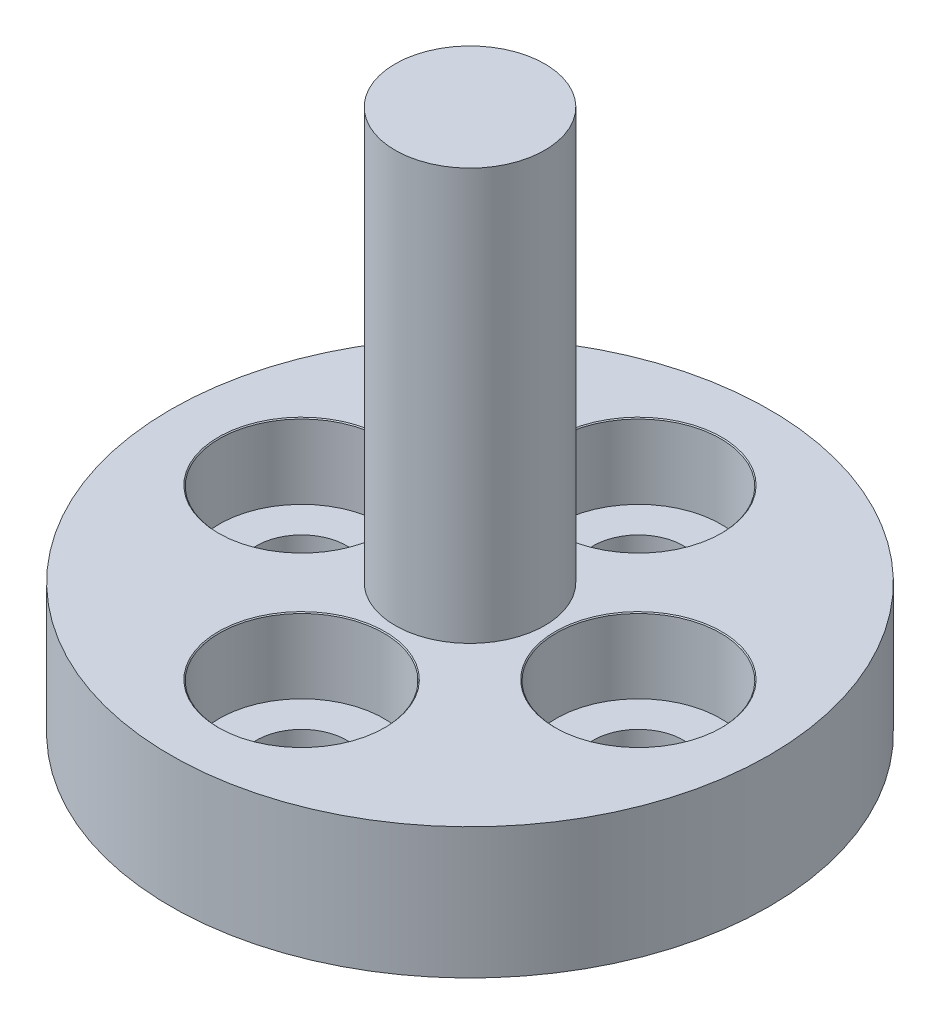
ISO-10303-21;
HEADER;
FILE_DESCRIPTION(('STEP AP214'),'2;1');
FILE_NAME('part.step','',(''),(''),'','','');
FILE_SCHEMA(('AUTOMOTIVE_DESIGN { 1 0 10303 214 1 1 1 1 }'));
ENDSEC;
DATA;
#1=APPLICATION_CONTEXT('core data for automotive mechanical design processes');
#2=APPLICATION_PROTOCOL_DEFINITION('international standard','automotive_design',2000,#1);
#3=PRODUCT_CONTEXT('',#1,'mechanical');
#4=PRODUCT('Part','Part','',(#3));
#5=PRODUCT_RELATED_PRODUCT_CATEGORY('part','',(#4));
#6=PRODUCT_DEFINITION_FORMATION('','',#4);
#7=PRODUCT_DEFINITION_CONTEXT('part definition',#1,'design');
#8=PRODUCT_DEFINITION('design','',#6,#7);
#9=PRODUCT_DEFINITION_SHAPE('','',#8);
#10=(LENGTH_UNIT() NAMED_UNIT(*) SI_UNIT(.MILLI.,.METRE.));
#11=(NAMED_UNIT(*) PLANE_ANGLE_UNIT() SI_UNIT($,.RADIAN.));
#12=(NAMED_UNIT(*) SI_UNIT($,.STERADIAN.) SOLID_ANGLE_UNIT());
#13=UNCERTAINTY_MEASURE_WITH_UNIT(LENGTH_MEASURE(1.E-05),#10,'distance_accuracy_value','');
#14=(GEOMETRIC_REPRESENTATION_CONTEXT(3) GLOBAL_UNCERTAINTY_ASSIGNED_CONTEXT((#13)) GLOBAL_UNIT_ASSIGNED_CONTEXT((#10,
#11,#12)) REPRESENTATION_CONTEXT('',''));
#15=CARTESIAN_POINT('',(0.,0.,0.));
#16=DIRECTION('',(0.,0.,1.));
#17=DIRECTION('',(1.,0.,0.));
#18=AXIS2_PLACEMENT_3D('',#15,#16,#17);
#19=CARTESIAN_POINT('',(0.,0.,0.));
#20=DIRECTION('',(0.,1.,0.));
#21=DIRECTION('',(-1.,0.,0.));
#22=AXIS2_PLACEMENT_3D('',#19,#20,#21);
#23=PLANE('',#22);
#24=CARTESIAN_POINT('',(-4.5,0.,0.));
#25=DIRECTION('',(0.,1.,0.));
#26=DIRECTION('',(0.,0.,1.));
#27=AXIS2_PLACEMENT_3D('',#24,#25,#26);
#28=CIRCLE('',#27,1.2);
#29=CARTESIAN_POINT('',(-4.5,0.,1.2));
#30=VERTEX_POINT('',#29);
#31=EDGE_CURVE('E99',#30,#30,#28,.T.);
#32=ORIENTED_EDGE('',*,*,#31,.T.);
#33=EDGE_LOOP('',(#32));
#34=FACE_BOUND('',#33,.T.);
#35=CARTESIAN_POINT('',(0.,0.,-4.5));
#36=DIRECTION('',(0.,1.,0.));
#37=DIRECTION('',(0.,0.,1.));
#38=AXIS2_PLACEMENT_3D('',#35,#36,#37);
#39=CIRCLE('',#38,1.2);
#40=CARTESIAN_POINT('',(0.,0.,-3.3));
#41=VERTEX_POINT('',#40);
#42=EDGE_CURVE('E84',#41,#41,#39,.T.);
#43=ORIENTED_EDGE('',*,*,#42,.T.);
#44=EDGE_LOOP('',(#43));
#45=FACE_BOUND('',#44,.T.);
#46=CARTESIAN_POINT('',(4.5,0.,0.));
#47=DIRECTION('',(0.,1.,0.));
#48=DIRECTION('',(0.,0.,1.));
#49=AXIS2_PLACEMENT_3D('',#46,#47,#48);
#50=CIRCLE('',#49,1.2);
#51=CARTESIAN_POINT('',(4.5,0.,1.2));
#52=VERTEX_POINT('',#51);
#53=EDGE_CURVE('E69',#52,#52,#50,.T.);
#54=ORIENTED_EDGE('',*,*,#53,.T.);
#55=EDGE_LOOP('',(#54));
#56=FACE_BOUND('',#55,.T.);
#57=CARTESIAN_POINT('',(0.,0.,4.5));
#58=DIRECTION('',(0.,1.,0.));
#59=DIRECTION('',(0.,0.,1.));
#60=AXIS2_PLACEMENT_3D('',#57,#58,#59);
#61=CIRCLE('',#60,1.2);
#62=CARTESIAN_POINT('',(0.,0.,5.7));
#63=VERTEX_POINT('',#62);
#64=EDGE_CURVE('E54',#63,#63,#61,.T.);
#65=ORIENTED_EDGE('',*,*,#64,.T.);
#66=EDGE_LOOP('',(#65));
#67=FACE_BOUND('',#66,.T.);
#68=CARTESIAN_POINT('',(0.,0.,0.));
#69=DIRECTION('',(0.,1.,0.));
#70=DIRECTION('',(-1.,0.,0.));
#71=AXIS2_PLACEMENT_3D('',#68,#69,#70);
#72=CIRCLE('',#71,8.);
#73=CARTESIAN_POINT('',(-8.,0.,0.));
#74=VERTEX_POINT('',#73);
#75=EDGE_CURVE('E10',#74,#74,#72,.T.);
#76=ORIENTED_EDGE('',*,*,#75,.F.);
#77=EDGE_LOOP('',(#76));
#78=FACE_BOUND('',#77,.T.);
#79=ADVANCED_FACE('F35',(#34,#45,#56,#67,#78),#23,.F.);
#80=CARTESIAN_POINT('',(0.,14.5,0.));
#81=DIRECTION('',(0.,1.,0.));
#82=DIRECTION('',(-1.,0.,0.));
#83=AXIS2_PLACEMENT_3D('',#80,#81,#82);
#84=CYLINDRICAL_SURFACE('',#83,8.);
#85=CARTESIAN_POINT('',(0.,3.5,0.));
#86=DIRECTION('',(0.,1.,0.));
#87=DIRECTION('',(-1.,0.,0.));
#88=AXIS2_PLACEMENT_3D('',#85,#86,#87);
#89=CIRCLE('',#88,8.);
#90=CARTESIAN_POINT('',(-8.,3.5,0.));
#91=VERTEX_POINT('',#90);
#92=EDGE_CURVE('E41',#91,#91,#89,.T.);
#93=ORIENTED_EDGE('',*,*,#92,.F.);
#94=EDGE_LOOP('',(#93));
#95=FACE_BOUND('',#94,.T.);
#96=ORIENTED_EDGE('',*,*,#75,.T.);
#97=EDGE_LOOP('',(#96));
#98=FACE_BOUND('',#97,.T.);
#99=ADVANCED_FACE('F121',(#95,#98),#84,.T.);
#100=CARTESIAN_POINT('',(8.,3.5,0.));
#101=DIRECTION('',(0.,-1.,0.));
#102=DIRECTION('',(1.,0.,0.));
#103=AXIS2_PLACEMENT_3D('',#100,#101,#102);
#104=PLANE('',#103);
#105=CARTESIAN_POINT('',(-4.5,3.5,0.));
#106=DIRECTION('',(0.,1.,0.));
#107=DIRECTION('',(0.,0.,1.));
#108=AXIS2_PLACEMENT_3D('',#105,#106,#107);
#109=CIRCLE('',#108,2.225);
#110=CARTESIAN_POINT('',(-4.5,3.5,2.225));
#111=VERTEX_POINT('',#110);
#112=EDGE_CURVE('E111',#111,#111,#109,.T.);
#113=ORIENTED_EDGE('',*,*,#112,.F.);
#114=EDGE_LOOP('',(#113));
#115=FACE_BOUND('',#114,.T.);
#116=CARTESIAN_POINT('',(0.,3.5,-4.5));
#117=DIRECTION('',(0.,1.,0.));
#118=DIRECTION('',(0.,0.,1.));
#119=AXIS2_PLACEMENT_3D('',#116,#117,#118);
#120=CIRCLE('',#119,2.225);
#121=CARTESIAN_POINT('',(0.,3.5,-2.275));
#122=VERTEX_POINT('',#121);
#123=EDGE_CURVE('E96',#122,#122,#120,.T.);
#124=ORIENTED_EDGE('',*,*,#123,.F.);
#125=EDGE_LOOP('',(#124));
#126=FACE_BOUND('',#125,.T.);
#127=CARTESIAN_POINT('',(4.5,3.5,0.));
#128=DIRECTION('',(0.,1.,0.));
#129=DIRECTION('',(0.,0.,1.));
#130=AXIS2_PLACEMENT_3D('',#127,#128,#129);
#131=CIRCLE('',#130,2.225);
#132=CARTESIAN_POINT('',(4.5,3.5,2.225));
#133=VERTEX_POINT('',#132);
#134=EDGE_CURVE('E81',#133,#133,#131,.T.);
#135=ORIENTED_EDGE('',*,*,#134,.F.);
#136=EDGE_LOOP('',(#135));
#137=FACE_BOUND('',#136,.T.);
#138=CARTESIAN_POINT('',(0.,3.5,4.5));
#139=DIRECTION('',(0.,1.,0.));
#140=DIRECTION('',(0.,0.,1.));
#141=AXIS2_PLACEMENT_3D('',#138,#139,#140);
#142=CIRCLE('',#141,2.225);
#143=CARTESIAN_POINT('',(0.,3.5,6.725));
#144=VERTEX_POINT('',#143);
#145=EDGE_CURVE('E66',#144,#144,#142,.T.);
#146=ORIENTED_EDGE('',*,*,#145,.F.);
#147=EDGE_LOOP('',(#146));
#148=FACE_BOUND('',#147,.T.);
#149=CARTESIAN_POINT('',(0.,3.5,0.));
#150=DIRECTION('',(0.,1.,0.));
#151=DIRECTION('',(-1.,0.,0.));
#152=AXIS2_PLACEMENT_3D('',#149,#150,#151);
#153=CIRCLE('',#152,2.);
#154=CARTESIAN_POINT('',(-2.,3.5,0.));
#155=VERTEX_POINT('',#154);
#156=EDGE_CURVE('E45',#155,#155,#153,.T.);
#157=ORIENTED_EDGE('',*,*,#156,.F.);
#158=EDGE_LOOP('',(#157));
#159=FACE_BOUND('',#158,.T.);
#160=ORIENTED_EDGE('',*,*,#92,.T.);
#161=EDGE_LOOP('',(#160));
#162=FACE_BOUND('',#161,.T.);
#163=ADVANCED_FACE('F117',(#115,#126,#137,#148,#159,#162),#104,.F.);
#164=CARTESIAN_POINT('',(0.,14.5,0.));
#165=DIRECTION('',(0.,1.,0.));
#166=DIRECTION('',(-1.,0.,0.));
#167=AXIS2_PLACEMENT_3D('',#164,#165,#166);
#168=CYLINDRICAL_SURFACE('',#167,2.);
#169=CARTESIAN_POINT('',(0.,14.5,0.));
#170=DIRECTION('',(0.,1.,0.));
#171=DIRECTION('',(-1.,0.,0.));
#172=AXIS2_PLACEMENT_3D('',#169,#170,#171);
#173=CIRCLE('',#172,2.);
#174=CARTESIAN_POINT('',(-2.,14.5,0.));
#175=VERTEX_POINT('',#174);
#176=EDGE_CURVE('E49',#175,#175,#173,.T.);
#177=ORIENTED_EDGE('',*,*,#176,.F.);
#178=EDGE_LOOP('',(#177));
#179=FACE_BOUND('',#178,.T.);
#180=ORIENTED_EDGE('',*,*,#156,.T.);
#181=EDGE_LOOP('',(#180));
#182=FACE_BOUND('',#181,.T.);
#183=ADVANCED_FACE('F120',(#179,#182),#168,.T.);
#184=CARTESIAN_POINT('',(2.,14.5,0.));
#185=DIRECTION('',(0.,-1.,0.));
#186=DIRECTION('',(1.,0.,0.));
#187=AXIS2_PLACEMENT_3D('',#184,#185,#186);
#188=PLANE('',#187);
#189=ORIENTED_EDGE('',*,*,#176,.T.);
#190=EDGE_LOOP('',(#189));
#191=FACE_BOUND('',#190,.T.);
#192=ADVANCED_FACE('F132',(#191),#188,.F.);
#193=CARTESIAN_POINT('',(0.,3.5,4.5));
#194=DIRECTION('',(0.,1.,0.));
#195=DIRECTION('',(0.,0.,1.));
#196=AXIS2_PLACEMENT_3D('',#193,#194,#195);
#197=CYLINDRICAL_SURFACE('',#196,1.2);
#198=ORIENTED_EDGE('',*,*,#64,.F.);
#199=EDGE_LOOP('',(#198));
#200=FACE_BOUND('',#199,.T.);
#201=CARTESIAN_POINT('',(0.,1.5,4.5));
#202=DIRECTION('',(0.,1.,0.));
#203=DIRECTION('',(0.,0.,1.));
#204=AXIS2_PLACEMENT_3D('',#201,#202,#203);
#205=CIRCLE('',#204,1.2);
#206=CARTESIAN_POINT('',(0.,1.5,5.7));
#207=VERTEX_POINT('',#206);
#208=EDGE_CURVE('E57',#207,#207,#205,.T.);
#209=ORIENTED_EDGE('',*,*,#208,.T.);
#210=EDGE_LOOP('',(#209));
#211=FACE_BOUND('',#210,.T.);
#212=ADVANCED_FACE('F138',(#200,#211),#197,.F.);
#213=CARTESIAN_POINT('',(2.2,1.5,4.5));
#214=DIRECTION('',(0.,-1.,0.));
#215=DIRECTION('',(0.,0.,-1.));
#216=AXIS2_PLACEMENT_3D('',#213,#214,#215);
#217=PLANE('',#216);
#218=ORIENTED_EDGE('',*,*,#208,.F.);
#219=EDGE_LOOP('',(#218));
#220=FACE_BOUND('',#219,.T.);
#221=CARTESIAN_POINT('',(0.,1.5,4.5));
#222=DIRECTION('',(0.,1.,0.));
#223=DIRECTION('',(0.,0.,1.));
#224=AXIS2_PLACEMENT_3D('',#221,#222,#223);
#225=CIRCLE('',#224,2.2);
#226=CARTESIAN_POINT('',(0.,1.5,6.7));
#227=VERTEX_POINT('',#226);
#228=EDGE_CURVE('E60',#227,#227,#225,.T.);
#229=ORIENTED_EDGE('',*,*,#228,.T.);
#230=EDGE_LOOP('',(#229));
#231=FACE_BOUND('',#230,.T.);
#232=ADVANCED_FACE('F159',(#220,#231),#217,.F.);
#233=CARTESIAN_POINT('',(0.,3.5,4.5));
#234=DIRECTION('',(0.,1.,0.));
#235=DIRECTION('',(0.,0.,1.));
#236=AXIS2_PLACEMENT_3D('',#233,#234,#235);
#237=CYLINDRICAL_SURFACE('',#236,2.2);
#238=ORIENTED_EDGE('',*,*,#228,.F.);
#239=EDGE_LOOP('',(#238));
#240=FACE_BOUND('',#239,.T.);
#241=CARTESIAN_POINT('',(0.,3.475,4.5));
#242=DIRECTION('',(0.,1.,0.));
#243=DIRECTION('',(0.,0.,1.));
#244=AXIS2_PLACEMENT_3D('',#241,#242,#243);
#245=CIRCLE('',#244,2.2);
#246=CARTESIAN_POINT('',(0.,3.475,6.7));
#247=VERTEX_POINT('',#246);
#248=EDGE_CURVE('E63',#247,#247,#245,.T.);
#249=ORIENTED_EDGE('',*,*,#248,.T.);
#250=EDGE_LOOP('',(#249));
#251=FACE_BOUND('',#250,.T.);
#252=ADVANCED_FACE('F165',(#240,#251),#237,.F.);
#253=CARTESIAN_POINT('',(0.,3.5,4.5));
#254=DIRECTION('',(0.,1.,0.));
#255=DIRECTION('',(0.,0.,1.));
#256=AXIS2_PLACEMENT_3D('',#253,#254,#255);
#257=CONICAL_SURFACE('',#256,2.225,0.785398163397457);
#258=ORIENTED_EDGE('',*,*,#248,.F.);
#259=EDGE_LOOP('',(#258));
#260=FACE_BOUND('',#259,.T.);
#261=ORIENTED_EDGE('',*,*,#145,.T.);
#262=EDGE_LOOP('',(#261));
#263=FACE_BOUND('',#262,.T.);
#264=ADVANCED_FACE('F171',(#260,#263),#257,.F.);
#265=CARTESIAN_POINT('',(4.5,3.5,0.));
#266=DIRECTION('',(0.,1.,0.));
#267=DIRECTION('',(0.,0.,1.));
#268=AXIS2_PLACEMENT_3D('',#265,#266,#267);
#269=CYLINDRICAL_SURFACE('',#268,1.2);
#270=ORIENTED_EDGE('',*,*,#53,.F.);
#271=EDGE_LOOP('',(#270));
#272=FACE_BOUND('',#271,.T.);
#273=CARTESIAN_POINT('',(4.5,1.5,0.));
#274=DIRECTION('',(0.,1.,0.));
#275=DIRECTION('',(0.,0.,1.));
#276=AXIS2_PLACEMENT_3D('',#273,#274,#275);
#277=CIRCLE('',#276,1.2);
#278=CARTESIAN_POINT('',(4.5,1.5,1.2));
#279=VERTEX_POINT('',#278);
#280=EDGE_CURVE('E72',#279,#279,#277,.T.);
#281=ORIENTED_EDGE('',*,*,#280,.T.);
#282=EDGE_LOOP('',(#281));
#283=FACE_BOUND('',#282,.T.);
#284=ADVANCED_FACE('F177',(#272,#283),#269,.F.);
#285=CARTESIAN_POINT('',(6.7,1.5,0.));
#286=DIRECTION('',(0.,-1.,0.));
#287=DIRECTION('',(0.,0.,-1.));
#288=AXIS2_PLACEMENT_3D('',#285,#286,#287);
#289=PLANE('',#288);
#290=ORIENTED_EDGE('',*,*,#280,.F.);
#291=EDGE_LOOP('',(#290));
#292=FACE_BOUND('',#291,.T.);
#293=CARTESIAN_POINT('',(4.5,1.5,0.));
#294=DIRECTION('',(0.,1.,0.));
#295=DIRECTION('',(0.,0.,1.));
#296=AXIS2_PLACEMENT_3D('',#293,#294,#295);
#297=CIRCLE('',#296,2.2);
#298=CARTESIAN_POINT('',(4.5,1.5,2.2));
#299=VERTEX_POINT('',#298);
#300=EDGE_CURVE('E75',#299,#299,#297,.T.);
#301=ORIENTED_EDGE('',*,*,#300,.T.);
#302=EDGE_LOOP('',(#301));
#303=FACE_BOUND('',#302,.T.);
#304=ADVANCED_FACE('F182',(#292,#303),#289,.F.);
#305=CARTESIAN_POINT('',(4.5,3.5,0.));
#306=DIRECTION('',(0.,1.,0.));
#307=DIRECTION('',(0.,0.,1.));
#308=AXIS2_PLACEMENT_3D('',#305,#306,#307);
#309=CYLINDRICAL_SURFACE('',#308,2.2);
#310=ORIENTED_EDGE('',*,*,#300,.F.);
#311=EDGE_LOOP('',(#310));
#312=FACE_BOUND('',#311,.T.);
#313=CARTESIAN_POINT('',(4.5,3.475,0.));
#314=DIRECTION('',(0.,1.,0.));
#315=DIRECTION('',(0.,0.,1.));
#316=AXIS2_PLACEMENT_3D('',#313,#314,#315);
#317=CIRCLE('',#316,2.2);
#318=CARTESIAN_POINT('',(4.5,3.475,2.2));
#319=VERTEX_POINT('',#318);
#320=EDGE_CURVE('E78',#319,#319,#317,.T.);
#321=ORIENTED_EDGE('',*,*,#320,.T.);
#322=EDGE_LOOP('',(#321));
#323=FACE_BOUND('',#322,.T.);
#324=ADVANCED_FACE('F188',(#312,#323),#309,.F.);
#325=CARTESIAN_POINT('',(4.5,3.5,0.));
#326=DIRECTION('',(0.,1.,0.));
#327=DIRECTION('',(0.,0.,1.));
#328=AXIS2_PLACEMENT_3D('',#325,#326,#327);
#329=CONICAL_SURFACE('',#328,2.225,0.785398163397466);
#330=ORIENTED_EDGE('',*,*,#320,.F.);
#331=EDGE_LOOP('',(#330));
#332=FACE_BOUND('',#331,.T.);
#333=ORIENTED_EDGE('',*,*,#134,.T.);
#334=EDGE_LOOP('',(#333));
#335=FACE_BOUND('',#334,.T.);
#336=ADVANCED_FACE('F192',(#332,#335),#329,.F.);
#337=CARTESIAN_POINT('',(0.,3.5,-4.5));
#338=DIRECTION('',(0.,1.,0.));
#339=DIRECTION('',(0.,0.,1.));
#340=AXIS2_PLACEMENT_3D('',#337,#338,#339);
#341=CYLINDRICAL_SURFACE('',#340,1.2);
#342=ORIENTED_EDGE('',*,*,#42,.F.);
#343=EDGE_LOOP('',(#342));
#344=FACE_BOUND('',#343,.T.);
#345=CARTESIAN_POINT('',(0.,1.5,-4.5));
#346=DIRECTION('',(0.,1.,0.));
#347=DIRECTION('',(0.,0.,1.));
#348=AXIS2_PLACEMENT_3D('',#345,#346,#347);
#349=CIRCLE('',#348,1.2);
#350=CARTESIAN_POINT('',(0.,1.5,-3.3));
#351=VERTEX_POINT('',#350);
#352=EDGE_CURVE('E87',#351,#351,#349,.T.);
#353=ORIENTED_EDGE('',*,*,#352,.T.);
#354=EDGE_LOOP('',(#353));
#355=FACE_BOUND('',#354,.T.);
#356=ADVANCED_FACE('F196',(#344,#355),#341,.F.);
#357=CARTESIAN_POINT('',(2.2,1.5,-4.5));
#358=DIRECTION('',(0.,-1.,0.));
#359=DIRECTION('',(0.,0.,-1.));
#360=AXIS2_PLACEMENT_3D('',#357,#358,#359);
#361=PLANE('',#360);
#362=ORIENTED_EDGE('',*,*,#352,.F.);
#363=EDGE_LOOP('',(#362));
#364=FACE_BOUND('',#363,.T.);
#365=CARTESIAN_POINT('',(0.,1.5,-4.5));
#366=DIRECTION('',(0.,1.,0.));
#367=DIRECTION('',(0.,0.,1.));
#368=AXIS2_PLACEMENT_3D('',#365,#366,#367);
#369=CIRCLE('',#368,2.2);
#370=CARTESIAN_POINT('',(0.,1.5,-2.3));
#371=VERTEX_POINT('',#370);
#372=EDGE_CURVE('E90',#371,#371,#369,.T.);
#373=ORIENTED_EDGE('',*,*,#372,.T.);
#374=EDGE_LOOP('',(#373));
#375=FACE_BOUND('',#374,.T.);
#376=ADVANCED_FACE('F200',(#364,#375),#361,.F.);
#377=CARTESIAN_POINT('',(0.,3.5,-4.5));
#378=DIRECTION('',(0.,1.,0.));
#379=DIRECTION('',(0.,0.,1.));
#380=AXIS2_PLACEMENT_3D('',#377,#378,#379);
#381=CYLINDRICAL_SURFACE('',#380,2.2);
#382=ORIENTED_EDGE('',*,*,#372,.F.);
#383=EDGE_LOOP('',(#382));
#384=FACE_BOUND('',#383,.T.);
#385=CARTESIAN_POINT('',(0.,3.475,-4.5));
#386=DIRECTION('',(0.,1.,0.));
#387=DIRECTION('',(0.,0.,1.));
#388=AXIS2_PLACEMENT_3D('',#385,#386,#387);
#389=CIRCLE('',#388,2.2);
#390=CARTESIAN_POINT('',(0.,3.475,-2.3));
#391=VERTEX_POINT('',#390);
#392=EDGE_CURVE('E93',#391,#391,#389,.T.);
#393=ORIENTED_EDGE('',*,*,#392,.T.);
#394=EDGE_LOOP('',(#393));
#395=FACE_BOUND('',#394,.T.);
#396=ADVANCED_FACE('F204',(#384,#395),#381,.F.);
#397=CARTESIAN_POINT('',(0.,3.5,-4.5));
#398=DIRECTION('',(0.,1.,0.));
#399=DIRECTION('',(0.,0.,1.));
#400=AXIS2_PLACEMENT_3D('',#397,#398,#399);
#401=CONICAL_SURFACE('',#400,2.225,0.785398163397457);
#402=ORIENTED_EDGE('',*,*,#392,.F.);
#403=EDGE_LOOP('',(#402));
#404=FACE_BOUND('',#403,.T.);
#405=ORIENTED_EDGE('',*,*,#123,.T.);
#406=EDGE_LOOP('',(#405));
#407=FACE_BOUND('',#406,.T.);
#408=ADVANCED_FACE('F208',(#404,#407),#401,.F.);
#409=CARTESIAN_POINT('',(-4.5,3.5,0.));
#410=DIRECTION('',(0.,1.,0.));
#411=DIRECTION('',(0.,0.,1.));
#412=AXIS2_PLACEMENT_3D('',#409,#410,#411);
#413=CYLINDRICAL_SURFACE('',#412,1.2);
#414=ORIENTED_EDGE('',*,*,#31,.F.);
#415=EDGE_LOOP('',(#414));
#416=FACE_BOUND('',#415,.T.);
#417=CARTESIAN_POINT('',(-4.5,1.5,0.));
#418=DIRECTION('',(0.,1.,0.));
#419=DIRECTION('',(0.,0.,1.));
#420=AXIS2_PLACEMENT_3D('',#417,#418,#419);
#421=CIRCLE('',#420,1.2);
#422=CARTESIAN_POINT('',(-4.5,1.5,1.2));
#423=VERTEX_POINT('',#422);
#424=EDGE_CURVE('E102',#423,#423,#421,.T.);
#425=ORIENTED_EDGE('',*,*,#424,.T.);
#426=EDGE_LOOP('',(#425));
#427=FACE_BOUND('',#426,.T.);
#428=ADVANCED_FACE('F212',(#416,#427),#413,.F.);
#429=CARTESIAN_POINT('',(-2.3,1.5,0.));
#430=DIRECTION('',(0.,-1.,0.));
#431=DIRECTION('',(0.,0.,-1.));
#432=AXIS2_PLACEMENT_3D('',#429,#430,#431);
#433=PLANE('',#432);
#434=ORIENTED_EDGE('',*,*,#424,.F.);
#435=EDGE_LOOP('',(#434));
#436=FACE_BOUND('',#435,.T.);
#437=CARTESIAN_POINT('',(-4.5,1.5,0.));
#438=DIRECTION('',(0.,1.,0.));
#439=DIRECTION('',(0.,0.,1.));
#440=AXIS2_PLACEMENT_3D('',#437,#438,#439);
#441=CIRCLE('',#440,2.2);
#442=CARTESIAN_POINT('',(-4.5,1.5,2.2));
#443=VERTEX_POINT('',#442);
#444=EDGE_CURVE('E105',#443,#443,#441,.T.);
#445=ORIENTED_EDGE('',*,*,#444,.T.);
#446=EDGE_LOOP('',(#445));
#447=FACE_BOUND('',#446,.T.);
#448=ADVANCED_FACE('F216',(#436,#447),#433,.F.);
#449=CARTESIAN_POINT('',(-4.5,3.5,0.));
#450=DIRECTION('',(0.,1.,0.));
#451=DIRECTION('',(0.,0.,1.));
#452=AXIS2_PLACEMENT_3D('',#449,#450,#451);
#453=CYLINDRICAL_SURFACE('',#452,2.2);
#454=ORIENTED_EDGE('',*,*,#444,.F.);
#455=EDGE_LOOP('',(#454));
#456=FACE_BOUND('',#455,.T.);
#457=CARTESIAN_POINT('',(-4.5,3.475,0.));
#458=DIRECTION('',(0.,1.,0.));
#459=DIRECTION('',(0.,0.,1.));
#460=AXIS2_PLACEMENT_3D('',#457,#458,#459);
#461=CIRCLE('',#460,2.2);
#462=CARTESIAN_POINT('',(-4.5,3.475,2.2));
#463=VERTEX_POINT('',#462);
#464=EDGE_CURVE('E108',#463,#463,#461,.T.);
#465=ORIENTED_EDGE('',*,*,#464,.T.);
#466=EDGE_LOOP('',(#465));
#467=FACE_BOUND('',#466,.T.);
#468=ADVANCED_FACE('F220',(#456,#467),#453,.F.);
#469=CARTESIAN_POINT('',(-4.5,3.5,0.));
#470=DIRECTION('',(0.,1.,0.));
#471=DIRECTION('',(0.,0.,1.));
#472=AXIS2_PLACEMENT_3D('',#469,#470,#471);
#473=CONICAL_SURFACE('',#472,2.225,0.785398163397457);
#474=ORIENTED_EDGE('',*,*,#464,.F.);
#475=EDGE_LOOP('',(#474));
#476=FACE_BOUND('',#475,.T.);
#477=ORIENTED_EDGE('',*,*,#112,.T.);
#478=EDGE_LOOP('',(#477));
#479=FACE_BOUND('',#478,.T.);
#480=ADVANCED_FACE('F115',(#476,#479),#473,.F.);
#481=CLOSED_SHELL('',(#79,#99,#163,#183,#192,#212,#232,#252,#264,#284,#304,#324,#336,#356,#376,
#396,#408,#428,#448,#468,#480));
#482=MANIFOLD_SOLID_BREP('B2',#481);
#483=ADVANCED_BREP_SHAPE_REPRESENTATION('',(#18,#482),#14);
#484=SHAPE_DEFINITION_REPRESENTATION(#9,#483);
ENDSEC;
END-ISO-10303-21;
